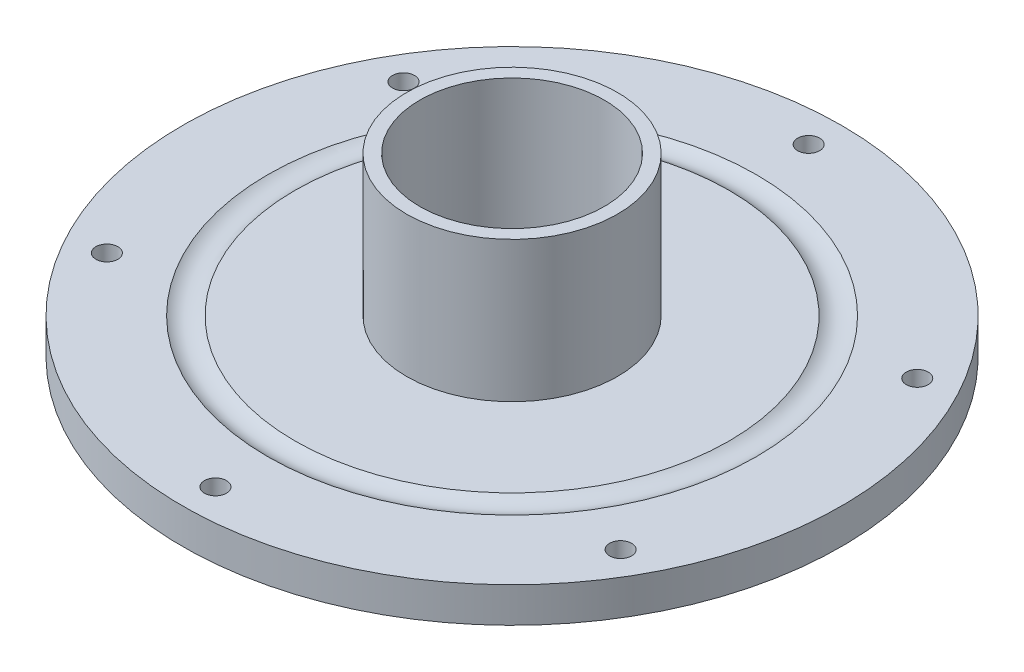
ISO-10303-21;
HEADER;
FILE_DESCRIPTION(('STEP AP214'),'2;1');
FILE_NAME('part.step','',(''),(''),'','','');
FILE_SCHEMA(('AUTOMOTIVE_DESIGN { 1 0 10303 214 1 1 1 1 }'));
ENDSEC;
DATA;
#1=APPLICATION_CONTEXT('core data for automotive mechanical design processes');
#2=APPLICATION_PROTOCOL_DEFINITION('international standard','automotive_design',2000,#1);
#3=PRODUCT_CONTEXT('',#1,'mechanical');
#4=PRODUCT('Part','Part','',(#3));
#5=PRODUCT_RELATED_PRODUCT_CATEGORY('part','',(#4));
#6=PRODUCT_DEFINITION_FORMATION('','',#4);
#7=PRODUCT_DEFINITION_CONTEXT('part definition',#1,'design');
#8=PRODUCT_DEFINITION('design','',#6,#7);
#9=PRODUCT_DEFINITION_SHAPE('','',#8);
#10=(LENGTH_UNIT() NAMED_UNIT(*) SI_UNIT(.MILLI.,.METRE.));
#11=(NAMED_UNIT(*) PLANE_ANGLE_UNIT() SI_UNIT($,.RADIAN.));
#12=(NAMED_UNIT(*) SI_UNIT($,.STERADIAN.) SOLID_ANGLE_UNIT());
#13=UNCERTAINTY_MEASURE_WITH_UNIT(LENGTH_MEASURE(1.E-05),#10,'distance_accuracy_value','');
#14=(GEOMETRIC_REPRESENTATION_CONTEXT(3) GLOBAL_UNCERTAINTY_ASSIGNED_CONTEXT((#13)) GLOBAL_UNIT_ASSIGNED_CONTEXT((#10,
#11,#12)) REPRESENTATION_CONTEXT('',''));
#15=CARTESIAN_POINT('',(0.,0.,0.));
#16=DIRECTION('',(0.,0.,1.));
#17=DIRECTION('',(1.,0.,0.));
#18=AXIS2_PLACEMENT_3D('',#15,#16,#17);
#19=CARTESIAN_POINT('',(47.,6.87240000000009,0.));
#20=DIRECTION('',(0.,1.,0.));
#21=DIRECTION('',(0.,0.,1.));
#22=AXIS2_PLACEMENT_3D('',#19,#20,#21);
#23=PLANE('',#22);
#24=CARTESIAN_POINT('',(0.,6.8724,0.));
#25=DIRECTION('',(0.,-1.,0.));
#26=DIRECTION('',(0.,0.,-1.));
#27=AXIS2_PLACEMENT_3D('',#24,#25,#26);
#28=CIRCLE('',#27,2.5);
#29=CARTESIAN_POINT('',(0.,6.8724,-2.5));
#30=VERTEX_POINT('',#29);
#31=EDGE_CURVE('E93',#30,#30,#28,.T.);
#32=ORIENTED_EDGE('',*,*,#31,.T.);
#33=EDGE_LOOP('',(#32));
#34=FACE_BOUND('',#33,.T.);
#35=CARTESIAN_POINT('',(-17.4999999999995,6.8724,-4.96308349082816E-13));
#36=DIRECTION('',(0.,-1.,0.));
#37=DIRECTION('',(0.,0.,-1.));
#38=AXIS2_PLACEMENT_3D('',#35,#36,#37);
#39=CIRCLE('',#38,1.9);
#40=CARTESIAN_POINT('',(-17.4999999999995,6.8724,-1.9000000000005));
#41=VERTEX_POINT('',#40);
#42=EDGE_CURVE('E89',#41,#41,#39,.T.);
#43=ORIENTED_EDGE('',*,*,#42,.T.);
#44=EDGE_LOOP('',(#43));
#45=FACE_BOUND('',#44,.T.);
#46=CARTESIAN_POINT('',(9.88330434368617E-13,6.8724,-17.5));
#47=DIRECTION('',(0.,-1.,0.));
#48=DIRECTION('',(0.,0.,-1.));
#49=AXIS2_PLACEMENT_3D('',#46,#47,#48);
#50=CIRCLE('',#49,1.9);
#51=CARTESIAN_POINT('',(9.88330434368617E-13,6.8724,-19.4));
#52=VERTEX_POINT('',#51);
#53=EDGE_CURVE('E97',#52,#52,#50,.T.);
#54=ORIENTED_EDGE('',*,*,#53,.T.);
#55=EDGE_LOOP('',(#54));
#56=FACE_BOUND('',#55,.T.);
#57=CARTESIAN_POINT('',(17.5000000000005,6.8724,4.94165217184309E-13));
#58=DIRECTION('',(0.,-1.,0.));
#59=DIRECTION('',(0.,0.,-1.));
#60=AXIS2_PLACEMENT_3D('',#57,#58,#59);
#61=CIRCLE('',#60,1.9);
#62=CARTESIAN_POINT('',(17.5000000000005,6.8724,-1.8999999999995));
#63=VERTEX_POINT('',#62);
#64=EDGE_CURVE('E94',#63,#63,#61,.T.);
#65=ORIENTED_EDGE('',*,*,#64,.T.);
#66=EDGE_LOOP('',(#65));
#67=FACE_BOUND('',#66,.T.);
#68=CARTESIAN_POINT('',(0.,6.8724,17.5));
#69=DIRECTION('',(0.,-1.,0.));
#70=DIRECTION('',(0.,0.,-1.));
#71=AXIS2_PLACEMENT_3D('',#68,#69,#70);
#72=CIRCLE('',#71,1.9);
#73=CARTESIAN_POINT('',(0.,6.8724,15.6));
#74=VERTEX_POINT('',#73);
#75=EDGE_CURVE('E90',#74,#74,#72,.T.);
#76=ORIENTED_EDGE('',*,*,#75,.T.);
#77=EDGE_LOOP('',(#76));
#78=FACE_BOUND('',#77,.T.);
#79=CARTESIAN_POINT('',(0.,6.8724000000001,0.));
#80=DIRECTION('',(0.,1.,0.));
#81=DIRECTION('',(0.,0.,1.));
#82=AXIS2_PLACEMENT_3D('',#79,#80,#81);
#83=CIRCLE('',#82,21.);
#84=CARTESIAN_POINT('',(0.,6.8724000000001,21.));
#85=VERTEX_POINT('',#84);
#86=EDGE_CURVE('E11',#85,#85,#83,.F.);
#87=ORIENTED_EDGE('',*,*,#86,.F.);
#88=EDGE_LOOP('',(#87));
#89=FACE_BOUND('',#88,.T.);
#90=ADVANCED_FACE('F41',(#34,#45,#56,#67,#78,#89),#23,.T.);
#91=CARTESIAN_POINT('',(0.,6.8724,0.));
#92=DIRECTION('',(0.,-1.,0.));
#93=DIRECTION('',(0.,0.,-1.));
#94=AXIS2_PLACEMENT_3D('',#91,#92,#93);
#95=CYLINDRICAL_SURFACE('',#94,2.5);
#96=ORIENTED_EDGE('',*,*,#31,.F.);
#97=EDGE_LOOP('',(#96));
#98=FACE_BOUND('',#97,.T.);
#99=CARTESIAN_POINT('',(0.,1.8724,0.));
#100=DIRECTION('',(0.,-1.,0.));
#101=DIRECTION('',(0.,0.,-1.));
#102=AXIS2_PLACEMENT_3D('',#99,#100,#101);
#103=CIRCLE('',#102,2.5);
#104=CARTESIAN_POINT('',(0.,1.8724,-2.5));
#105=VERTEX_POINT('',#104);
#106=EDGE_CURVE('E86',#105,#105,#103,.F.);
#107=ORIENTED_EDGE('',*,*,#106,.F.);
#108=EDGE_LOOP('',(#107));
#109=FACE_BOUND('',#108,.T.);
#110=ADVANCED_FACE('F127',(#98,#109),#95,.F.);
#111=CARTESIAN_POINT('',(-17.4999999999995,6.8724,-4.96308349082816E-13));
#112=DIRECTION('',(0.,-1.,0.));
#113=DIRECTION('',(0.,0.,-1.));
#114=AXIS2_PLACEMENT_3D('',#111,#112,#113);
#115=CYLINDRICAL_SURFACE('',#114,1.9);
#116=ORIENTED_EDGE('',*,*,#42,.F.);
#117=EDGE_LOOP('',(#116));
#118=FACE_BOUND('',#117,.T.);
#119=CARTESIAN_POINT('',(-17.4999999999995,1.8724,-4.96308349082816E-13));
#120=DIRECTION('',(0.,-1.,0.));
#121=DIRECTION('',(0.,0.,-1.));
#122=AXIS2_PLACEMENT_3D('',#119,#120,#121);
#123=CIRCLE('',#122,1.9);
#124=CARTESIAN_POINT('',(-17.4999999999995,1.8724,-1.9000000000005));
#125=VERTEX_POINT('',#124);
#126=EDGE_CURVE('E83',#125,#125,#123,.F.);
#127=ORIENTED_EDGE('',*,*,#126,.F.);
#128=EDGE_LOOP('',(#127));
#129=FACE_BOUND('',#128,.T.);
#130=ADVANCED_FACE('F133',(#118,#129),#115,.F.);
#131=CARTESIAN_POINT('',(9.88330434368617E-13,6.8724,-17.5));
#132=DIRECTION('',(0.,-1.,0.));
#133=DIRECTION('',(0.,0.,-1.));
#134=AXIS2_PLACEMENT_3D('',#131,#132,#133);
#135=CYLINDRICAL_SURFACE('',#134,1.9);
#136=ORIENTED_EDGE('',*,*,#53,.F.);
#137=EDGE_LOOP('',(#136));
#138=FACE_BOUND('',#137,.T.);
#139=CARTESIAN_POINT('',(9.88330434368617E-13,1.8724,-17.5));
#140=DIRECTION('',(0.,-1.,0.));
#141=DIRECTION('',(0.,0.,-1.));
#142=AXIS2_PLACEMENT_3D('',#139,#140,#141);
#143=CIRCLE('',#142,1.9);
#144=CARTESIAN_POINT('',(9.88330434368617E-13,1.8724,-19.4));
#145=VERTEX_POINT('',#144);
#146=EDGE_CURVE('E67',#145,#145,#143,.F.);
#147=ORIENTED_EDGE('',*,*,#146,.F.);
#148=EDGE_LOOP('',(#147));
#149=FACE_BOUND('',#148,.T.);
#150=ADVANCED_FACE('F262',(#138,#149),#135,.F.);
#151=CARTESIAN_POINT('',(17.5000000000005,6.8724,4.94165217184309E-13));
#152=DIRECTION('',(0.,-1.,0.));
#153=DIRECTION('',(0.,0.,-1.));
#154=AXIS2_PLACEMENT_3D('',#151,#152,#153);
#155=CYLINDRICAL_SURFACE('',#154,1.9);
#156=ORIENTED_EDGE('',*,*,#64,.F.);
#157=EDGE_LOOP('',(#156));
#158=FACE_BOUND('',#157,.T.);
#159=CARTESIAN_POINT('',(17.5000000000005,1.8724,4.94165217184309E-13));
#160=DIRECTION('',(0.,-1.,0.));
#161=DIRECTION('',(0.,0.,-1.));
#162=AXIS2_PLACEMENT_3D('',#159,#160,#161);
#163=CIRCLE('',#162,1.9);
#164=CARTESIAN_POINT('',(17.5000000000005,1.8724,-1.8999999999995));
#165=VERTEX_POINT('',#164);
#166=EDGE_CURVE('E62',#165,#165,#163,.F.);
#167=ORIENTED_EDGE('',*,*,#166,.F.);
#168=EDGE_LOOP('',(#167));
#169=FACE_BOUND('',#168,.T.);
#170=ADVANCED_FACE('F258',(#158,#169),#155,.F.);
#171=CARTESIAN_POINT('',(0.,6.8724,17.5));
#172=DIRECTION('',(0.,-1.,0.));
#173=DIRECTION('',(0.,0.,-1.));
#174=AXIS2_PLACEMENT_3D('',#171,#172,#173);
#175=CYLINDRICAL_SURFACE('',#174,1.9);
#176=ORIENTED_EDGE('',*,*,#75,.F.);
#177=EDGE_LOOP('',(#176));
#178=FACE_BOUND('',#177,.T.);
#179=CARTESIAN_POINT('',(0.,1.8724,17.5));
#180=DIRECTION('',(0.,-1.,0.));
#181=DIRECTION('',(0.,0.,-1.));
#182=AXIS2_PLACEMENT_3D('',#179,#180,#181);
#183=CIRCLE('',#182,1.9);
#184=CARTESIAN_POINT('',(0.,1.8724,15.6));
#185=VERTEX_POINT('',#184);
#186=EDGE_CURVE('E60',#185,#185,#183,.F.);
#187=ORIENTED_EDGE('',*,*,#186,.F.);
#188=EDGE_LOOP('',(#187));
#189=FACE_BOUND('',#188,.T.);
#190=ADVANCED_FACE('F145',(#178,#189),#175,.F.);
#191=CARTESIAN_POINT('',(59.,-1.1276,0.));
#192=DIRECTION('',(0.,-1.,0.));
#193=DIRECTION('',(0.,0.,-1.));
#194=AXIS2_PLACEMENT_3D('',#191,#192,#193);
#195=PLANE('',#194);
#196=CARTESIAN_POINT('',(-42.2194600806596,-1.1276,-16.1979597933077));
#197=DIRECTION('',(0.,-1.,0.));
#198=DIRECTION('',(0.,0.,-1.));
#199=AXIS2_PLACEMENT_3D('',#196,#197,#198);
#200=CIRCLE('',#199,2.);
#201=CARTESIAN_POINT('',(-42.2194600806596,-1.1276,-18.1979597933077));
#202=VERTEX_POINT('',#201);
#203=EDGE_CURVE('E200',#202,#202,#200,.T.);
#204=ORIENTED_EDGE('',*,*,#203,.F.);
#205=EDGE_LOOP('',(#204));
#206=FACE_BOUND('',#205,.T.);
#207=CARTESIAN_POINT('',(-40.9509841413659,-1.1276,20.1763276645553));
#208=DIRECTION('',(0.,-1.,0.));
#209=DIRECTION('',(0.,0.,-1.));
#210=AXIS2_PLACEMENT_3D('',#207,#208,#209);
#211=CIRCLE('',#210,2.);
#212=CARTESIAN_POINT('',(-40.9509841413659,-1.1276,18.1763276645552));
#213=VERTEX_POINT('',#212);
#214=EDGE_CURVE('E206',#213,#213,#211,.T.);
#215=ORIENTED_EDGE('',*,*,#214,.F.);
#216=EDGE_LOOP('',(#215));
#217=FACE_BOUND('',#216,.T.);
#218=CARTESIAN_POINT('',(21.1606113619128,-1.1276,39.7451837331136));
#219=DIRECTION('',(0.,-1.,0.));
#220=DIRECTION('',(0.,0.,-1.));
#221=AXIS2_PLACEMENT_3D('',#218,#219,#220);
#222=CIRCLE('',#221,2.);
#223=CARTESIAN_POINT('',(21.1606113619128,-1.1276,37.7451837331136));
#224=VERTEX_POINT('',#223);
#225=EDGE_CURVE('E212',#224,#224,#222,.T.);
#226=ORIENTED_EDGE('',*,*,#225,.F.);
#227=EDGE_LOOP('',(#226));
#228=FACE_BOUND('',#227,.T.);
#229=CARTESIAN_POINT('',(-15.1004584332728,-1.1276,42.8808872561681));
#230=DIRECTION('',(0.,-1.,0.));
#231=DIRECTION('',(0.,0.,-1.));
#232=AXIS2_PLACEMENT_3D('',#229,#230,#231);
#233=CIRCLE('',#232,2.);
#234=CARTESIAN_POINT('',(-15.1004584332728,-1.1276,40.8808872561681));
#235=VERTEX_POINT('',#234);
#236=EDGE_CURVE('E194',#235,#235,#233,.T.);
#237=ORIENTED_EDGE('',*,*,#236,.F.);
#238=EDGE_LOOP('',(#237));
#239=FACE_BOUND('',#238,.T.);
#240=CARTESIAN_POINT('',(0.,-1.1276,-67.5));
#241=DIRECTION('',(0.,-1.,0.));
#242=DIRECTION('',(0.,0.,-1.));
#243=AXIS2_PLACEMENT_3D('',#240,#241,#242);
#244=CIRCLE('',#243,2.5);
#245=CARTESIAN_POINT('',(0.,-1.1276,-70.));
#246=VERTEX_POINT('',#245);
#247=EDGE_CURVE('E158',#246,#246,#244,.T.);
#248=ORIENTED_EDGE('',*,*,#247,.F.);
#249=EDGE_LOOP('',(#248));
#250=FACE_BOUND('',#249,.T.);
#251=CARTESIAN_POINT('',(58.4567147554496,-1.1276,-33.75));
#252=DIRECTION('',(0.,-1.,0.));
#253=DIRECTION('',(0.,0.,-1.));
#254=AXIS2_PLACEMENT_3D('',#251,#252,#253);
#255=CIRCLE('',#254,2.5);
#256=CARTESIAN_POINT('',(58.4567147554496,-1.1276,-36.25));
#257=VERTEX_POINT('',#256);
#258=EDGE_CURVE('E186',#257,#257,#255,.T.);
#259=ORIENTED_EDGE('',*,*,#258,.F.);
#260=EDGE_LOOP('',(#259));
#261=FACE_BOUND('',#260,.T.);
#262=CARTESIAN_POINT('',(58.4567147554496,-1.1276,33.75));
#263=DIRECTION('',(0.,-1.,0.));
#264=DIRECTION('',(0.,0.,-1.));
#265=AXIS2_PLACEMENT_3D('',#262,#263,#264);
#266=CIRCLE('',#265,2.5);
#267=CARTESIAN_POINT('',(58.4567147554496,-1.1276,31.25));
#268=VERTEX_POINT('',#267);
#269=EDGE_CURVE('E161',#268,#268,#266,.T.);
#270=ORIENTED_EDGE('',*,*,#269,.F.);
#271=EDGE_LOOP('',(#270));
#272=FACE_BOUND('',#271,.T.);
#273=CARTESIAN_POINT('',(0.,-1.1276,67.5));
#274=DIRECTION('',(0.,-1.,0.));
#275=DIRECTION('',(0.,0.,-1.));
#276=AXIS2_PLACEMENT_3D('',#273,#274,#275);
#277=CIRCLE('',#276,2.5);
#278=CARTESIAN_POINT('',(0.,-1.1276,65.));
#279=VERTEX_POINT('',#278);
#280=EDGE_CURVE('E168',#279,#279,#277,.T.);
#281=ORIENTED_EDGE('',*,*,#280,.F.);
#282=EDGE_LOOP('',(#281));
#283=FACE_BOUND('',#282,.T.);
#284=CARTESIAN_POINT('',(-58.4567147554496,-1.1276,33.75));
#285=DIRECTION('',(0.,-1.,0.));
#286=DIRECTION('',(0.,0.,-1.));
#287=AXIS2_PLACEMENT_3D('',#284,#285,#286);
#288=CIRCLE('',#287,2.5);
#289=CARTESIAN_POINT('',(-58.4567147554496,-1.1276,31.25));
#290=VERTEX_POINT('',#289);
#291=EDGE_CURVE('E174',#290,#290,#288,.T.);
#292=ORIENTED_EDGE('',*,*,#291,.F.);
#293=EDGE_LOOP('',(#292));
#294=FACE_BOUND('',#293,.T.);
#295=CARTESIAN_POINT('',(-58.4567147554496,-1.1276,-33.75));
#296=DIRECTION('',(0.,-1.,0.));
#297=DIRECTION('',(0.,0.,-1.));
#298=AXIS2_PLACEMENT_3D('',#295,#296,#297);
#299=CIRCLE('',#298,2.5);
#300=CARTESIAN_POINT('',(-58.4567147554496,-1.1276,-36.25));
#301=VERTEX_POINT('',#300);
#302=EDGE_CURVE('E180',#301,#301,#299,.T.);
#303=ORIENTED_EDGE('',*,*,#302,.F.);
#304=EDGE_LOOP('',(#303));
#305=FACE_BOUND('',#304,.T.);
#306=CARTESIAN_POINT('',(0.,-1.1276,0.));
#307=DIRECTION('',(0.,-1.,0.));
#308=DIRECTION('',(0.,0.,-1.));
#309=AXIS2_PLACEMENT_3D('',#306,#307,#308);
#310=CIRCLE('',#309,22.5);
#311=CARTESIAN_POINT('',(0.,-1.1276,-22.5));
#312=VERTEX_POINT('',#311);
#313=EDGE_CURVE('E70',#312,#312,#310,.T.);
#314=ORIENTED_EDGE('',*,*,#313,.F.);
#315=EDGE_LOOP('',(#314));
#316=FACE_BOUND('',#315,.T.);
#317=CARTESIAN_POINT('',(0.,-1.1276,0.));
#318=DIRECTION('',(0.,-1.,0.));
#319=DIRECTION('',(0.,0.,-1.));
#320=AXIS2_PLACEMENT_3D('',#317,#318,#319);
#321=CIRCLE('',#320,75.);
#322=CARTESIAN_POINT('',(0.,-1.1276,-75.));
#323=VERTEX_POINT('',#322);
#324=EDGE_CURVE('E104',#323,#323,#321,.T.);
#325=ORIENTED_EDGE('',*,*,#324,.T.);
#326=EDGE_LOOP('',(#325));
#327=FACE_BOUND('',#326,.T.);
#328=ADVANCED_FACE('F43',(#206,#217,#228,#239,#250,#261,#272,#283,#294,#305,#316,#327),#195,.T.);
#329=CARTESIAN_POINT('',(0.,6.87240000000009,0.));
#330=DIRECTION('',(0.,1.,0.));
#331=DIRECTION('',(0.,0.,1.));
#332=AXIS2_PLACEMENT_3D('',#329,#330,#331);
#333=CIRCLE('',#332,24.);
#334=CARTESIAN_POINT('',(0.,6.87240000000009,24.));
#335=VERTEX_POINT('',#334);
#336=EDGE_CURVE('E78',#335,#335,#333,.T.);
#337=ORIENTED_EDGE('',*,*,#336,.F.);
#338=EDGE_LOOP('',(#337));
#339=FACE_BOUND('',#338,.T.);
#340=CARTESIAN_POINT('',(0.,6.8724,0.));
#341=DIRECTION('',(0.,1.,0.));
#342=DIRECTION('',(0.,0.,1.));
#343=AXIS2_PLACEMENT_3D('',#340,#341,#342);
#344=CIRCLE('',#343,49.4043);
#345=CARTESIAN_POINT('',(0.,6.8724,49.4043));
#346=VERTEX_POINT('',#345);
#347=EDGE_CURVE('E48',#346,#346,#344,.T.);
#348=ORIENTED_EDGE('',*,*,#347,.T.);
#349=EDGE_LOOP('',(#348));
#350=FACE_BOUND('',#349,.T.);
#351=ADVANCED_FACE('F129',(#339,#350),#23,.T.);
#352=CARTESIAN_POINT('',(0.,11.,0.));
#353=DIRECTION('',(0.,1.,0.));
#354=DIRECTION('',(0.,0.,1.));
#355=AXIS2_PLACEMENT_3D('',#352,#353,#354);
#356=TOROIDAL_SURFACE('',#355,52.5,5.15950000000006);
#357=CARTESIAN_POINT('',(0.,6.87239999999989,0.));
#358=DIRECTION('',(0.,1.,0.));
#359=DIRECTION('',(0.,0.,1.));
#360=AXIS2_PLACEMENT_3D('',#357,#358,#359);
#361=CIRCLE('',#360,55.5957);
#362=CARTESIAN_POINT('',(0.,6.87239999999989,55.5957));
#363=VERTEX_POINT('',#362);
#364=EDGE_CURVE('E52',#363,#363,#361,.T.);
#365=ORIENTED_EDGE('',*,*,#364,.T.);
#366=EDGE_LOOP('',(#365));
#367=FACE_BOUND('',#366,.T.);
#368=ORIENTED_EDGE('',*,*,#347,.F.);
#369=EDGE_LOOP('',(#368));
#370=FACE_BOUND('',#369,.T.);
#371=ADVANCED_FACE('F122',(#367,#370),#356,.F.);
#372=CARTESIAN_POINT('',(55.5957,6.87239999999995,0.));
#373=DIRECTION('',(0.,1.,0.));
#374=DIRECTION('',(0.,0.,1.));
#375=AXIS2_PLACEMENT_3D('',#372,#373,#374);
#376=PLANE('',#375);
#377=CARTESIAN_POINT('',(0.,6.8724,-67.5));
#378=DIRECTION('',(0.,-1.,0.));
#379=DIRECTION('',(0.,0.,-1.));
#380=AXIS2_PLACEMENT_3D('',#377,#378,#379);
#381=CIRCLE('',#380,2.5);
#382=CARTESIAN_POINT('',(0.,6.8724,-70.));
#383=VERTEX_POINT('',#382);
#384=EDGE_CURVE('E153',#383,#383,#381,.T.);
#385=ORIENTED_EDGE('',*,*,#384,.T.);
#386=EDGE_LOOP('',(#385));
#387=FACE_BOUND('',#386,.T.);
#388=CARTESIAN_POINT('',(58.4567147554496,6.8724,-33.75));
#389=DIRECTION('',(0.,-1.,0.));
#390=DIRECTION('',(0.,0.,-1.));
#391=AXIS2_PLACEMENT_3D('',#388,#389,#390);
#392=CIRCLE('',#391,2.5);
#393=CARTESIAN_POINT('',(58.4567147554496,6.8724,-36.25));
#394=VERTEX_POINT('',#393);
#395=EDGE_CURVE('E165',#394,#394,#392,.T.);
#396=ORIENTED_EDGE('',*,*,#395,.T.);
#397=EDGE_LOOP('',(#396));
#398=FACE_BOUND('',#397,.T.);
#399=CARTESIAN_POINT('',(58.4567147554496,6.8724,33.75));
#400=DIRECTION('',(0.,-1.,0.));
#401=DIRECTION('',(0.,0.,-1.));
#402=AXIS2_PLACEMENT_3D('',#399,#400,#401);
#403=CIRCLE('',#402,2.5);
#404=CARTESIAN_POINT('',(58.4567147554496,6.8724,31.25));
#405=VERTEX_POINT('',#404);
#406=EDGE_CURVE('E164',#405,#405,#403,.T.);
#407=ORIENTED_EDGE('',*,*,#406,.T.);
#408=EDGE_LOOP('',(#407));
#409=FACE_BOUND('',#408,.T.);
#410=CARTESIAN_POINT('',(0.,6.8724,67.5));
#411=DIRECTION('',(0.,-1.,0.));
#412=DIRECTION('',(0.,0.,-1.));
#413=AXIS2_PLACEMENT_3D('',#410,#411,#412);
#414=CIRCLE('',#413,2.5);
#415=CARTESIAN_POINT('',(0.,6.8724,65.));
#416=VERTEX_POINT('',#415);
#417=EDGE_CURVE('E171',#416,#416,#414,.T.);
#418=ORIENTED_EDGE('',*,*,#417,.T.);
#419=EDGE_LOOP('',(#418));
#420=FACE_BOUND('',#419,.T.);
#421=CARTESIAN_POINT('',(-58.4567147554496,6.8724,33.75));
#422=DIRECTION('',(0.,-1.,0.));
#423=DIRECTION('',(0.,0.,-1.));
#424=AXIS2_PLACEMENT_3D('',#421,#422,#423);
#425=CIRCLE('',#424,2.5);
#426=CARTESIAN_POINT('',(-58.4567147554496,6.8724,31.25));
#427=VERTEX_POINT('',#426);
#428=EDGE_CURVE('E177',#427,#427,#425,.T.);
#429=ORIENTED_EDGE('',*,*,#428,.T.);
#430=EDGE_LOOP('',(#429));
#431=FACE_BOUND('',#430,.T.);
#432=CARTESIAN_POINT('',(-58.4567147554496,6.8724,-33.75));
#433=DIRECTION('',(0.,-1.,0.));
#434=DIRECTION('',(0.,0.,-1.));
#435=AXIS2_PLACEMENT_3D('',#432,#433,#434);
#436=CIRCLE('',#435,2.5);
#437=CARTESIAN_POINT('',(-58.4567147554496,6.8724,-36.25));
#438=VERTEX_POINT('',#437);
#439=EDGE_CURVE('E183',#438,#438,#436,.T.);
#440=ORIENTED_EDGE('',*,*,#439,.T.);
#441=EDGE_LOOP('',(#440));
#442=FACE_BOUND('',#441,.T.);
#443=ORIENTED_EDGE('',*,*,#364,.F.);
#444=EDGE_LOOP('',(#443));
#445=FACE_BOUND('',#444,.T.);
#446=CARTESIAN_POINT('',(0.,6.8724,0.));
#447=DIRECTION('',(0.,-1.,0.));
#448=DIRECTION('',(0.,0.,-1.));
#449=AXIS2_PLACEMENT_3D('',#446,#447,#448);
#450=CIRCLE('',#449,75.);
#451=CARTESIAN_POINT('',(0.,6.8724,-75.));
#452=VERTEX_POINT('',#451);
#453=EDGE_CURVE('E57',#452,#452,#450,.T.);
#454=ORIENTED_EDGE('',*,*,#453,.F.);
#455=EDGE_LOOP('',(#454));
#456=FACE_BOUND('',#455,.T.);
#457=ADVANCED_FACE('F113',(#387,#398,#409,#420,#431,#442,#445,#456),#376,.T.);
#458=CARTESIAN_POINT('',(0.,6.8724,0.));
#459=DIRECTION('',(0.,-1.,0.));
#460=DIRECTION('',(0.,0.,-1.));
#461=AXIS2_PLACEMENT_3D('',#458,#459,#460);
#462=CYLINDRICAL_SURFACE('',#461,75.);
#463=ORIENTED_EDGE('',*,*,#453,.T.);
#464=EDGE_LOOP('',(#463));
#465=FACE_BOUND('',#464,.T.);
#466=ORIENTED_EDGE('',*,*,#324,.F.);
#467=EDGE_LOOP('',(#466));
#468=FACE_BOUND('',#467,.T.);
#469=ADVANCED_FACE('F110',(#465,#468),#462,.T.);
#470=CARTESIAN_POINT('',(0.,1.8724,0.));
#471=DIRECTION('',(0.,-1.,0.));
#472=DIRECTION('',(0.,0.,-1.));
#473=AXIS2_PLACEMENT_3D('',#470,#471,#472);
#474=PLANE('',#473);
#475=CARTESIAN_POINT('',(0.,1.8724,0.));
#476=DIRECTION('',(0.,-1.,0.));
#477=DIRECTION('',(0.,0.,-1.));
#478=AXIS2_PLACEMENT_3D('',#475,#476,#477);
#479=CIRCLE('',#478,22.5);
#480=CARTESIAN_POINT('',(0.,1.8724,-22.5));
#481=VERTEX_POINT('',#480);
#482=EDGE_CURVE('E63',#481,#481,#479,.T.);
#483=ORIENTED_EDGE('',*,*,#482,.T.);
#484=EDGE_LOOP('',(#483));
#485=FACE_BOUND('',#484,.T.);
#486=ORIENTED_EDGE('',*,*,#186,.T.);
#487=EDGE_LOOP('',(#486));
#488=FACE_BOUND('',#487,.T.);
#489=ORIENTED_EDGE('',*,*,#166,.T.);
#490=EDGE_LOOP('',(#489));
#491=FACE_BOUND('',#490,.T.);
#492=ORIENTED_EDGE('',*,*,#146,.T.);
#493=EDGE_LOOP('',(#492));
#494=FACE_BOUND('',#493,.T.);
#495=ORIENTED_EDGE('',*,*,#126,.T.);
#496=EDGE_LOOP('',(#495));
#497=FACE_BOUND('',#496,.T.);
#498=ORIENTED_EDGE('',*,*,#106,.T.);
#499=EDGE_LOOP('',(#498));
#500=FACE_BOUND('',#499,.T.);
#501=ADVANCED_FACE('F112',(#485,#488,#491,#494,#497,#500),#474,.T.);
#502=CARTESIAN_POINT('',(0.,1.8724,0.));
#503=DIRECTION('',(0.,-1.,0.));
#504=DIRECTION('',(0.,0.,-1.));
#505=AXIS2_PLACEMENT_3D('',#502,#503,#504);
#506=CYLINDRICAL_SURFACE('',#505,22.5);
#507=ORIENTED_EDGE('',*,*,#482,.F.);
#508=EDGE_LOOP('',(#507));
#509=FACE_BOUND('',#508,.T.);
#510=ORIENTED_EDGE('',*,*,#313,.T.);
#511=EDGE_LOOP('',(#510));
#512=FACE_BOUND('',#511,.T.);
#513=ADVANCED_FACE('F120',(#509,#512),#506,.F.);
#514=CARTESIAN_POINT('',(0.,38.8724000000001,0.));
#515=DIRECTION('',(0.,1.,0.));
#516=DIRECTION('',(0.,0.,1.));
#517=AXIS2_PLACEMENT_3D('',#514,#515,#516);
#518=PLANE('',#517);
#519=CARTESIAN_POINT('',(0.,38.8724000000001,0.));
#520=DIRECTION('',(0.,1.,0.));
#521=DIRECTION('',(0.,0.,1.));
#522=AXIS2_PLACEMENT_3D('',#519,#520,#521);
#523=CIRCLE('',#522,24.);
#524=CARTESIAN_POINT('',(0.,38.8724000000001,24.));
#525=VERTEX_POINT('',#524);
#526=EDGE_CURVE('E75',#525,#525,#523,.T.);
#527=ORIENTED_EDGE('',*,*,#526,.T.);
#528=EDGE_LOOP('',(#527));
#529=FACE_BOUND('',#528,.T.);
#530=CARTESIAN_POINT('',(0.,38.8724000000001,0.));
#531=DIRECTION('',(0.,1.,0.));
#532=DIRECTION('',(0.,0.,1.));
#533=AXIS2_PLACEMENT_3D('',#530,#531,#532);
#534=CIRCLE('',#533,21.);
#535=CARTESIAN_POINT('',(0.,38.8724000000001,21.));
#536=VERTEX_POINT('',#535);
#537=EDGE_CURVE('E150',#536,#536,#534,.T.);
#538=ORIENTED_EDGE('',*,*,#537,.F.);
#539=EDGE_LOOP('',(#538));
#540=FACE_BOUND('',#539,.T.);
#541=ADVANCED_FACE('F245',(#529,#540),#518,.T.);
#542=CARTESIAN_POINT('',(0.,38.8724000000001,0.));
#543=DIRECTION('',(0.,-1.,0.));
#544=DIRECTION('',(0.,0.,-1.));
#545=AXIS2_PLACEMENT_3D('',#542,#543,#544);
#546=CYLINDRICAL_SURFACE('',#545,24.);
#547=ORIENTED_EDGE('',*,*,#526,.F.);
#548=EDGE_LOOP('',(#547));
#549=FACE_BOUND('',#548,.T.);
#550=ORIENTED_EDGE('',*,*,#336,.T.);
#551=EDGE_LOOP('',(#550));
#552=FACE_BOUND('',#551,.T.);
#553=ADVANCED_FACE('F251',(#549,#552),#546,.T.);
#554=CARTESIAN_POINT('',(0.,38.8724000000001,0.));
#555=DIRECTION('',(0.,-1.,0.));
#556=DIRECTION('',(0.,0.,-1.));
#557=AXIS2_PLACEMENT_3D('',#554,#555,#556);
#558=CYLINDRICAL_SURFACE('',#557,21.);
#559=ORIENTED_EDGE('',*,*,#537,.T.);
#560=EDGE_LOOP('',(#559));
#561=FACE_BOUND('',#560,.T.);
#562=ORIENTED_EDGE('',*,*,#86,.T.);
#563=EDGE_LOOP('',(#562));
#564=FACE_BOUND('',#563,.T.);
#565=ADVANCED_FACE('F407',(#561,#564),#558,.F.);
#566=CARTESIAN_POINT('',(-58.4567147554496,6.8724,-33.75));
#567=DIRECTION('',(0.,-1.,0.));
#568=DIRECTION('',(0.,0.,-1.));
#569=AXIS2_PLACEMENT_3D('',#566,#567,#568);
#570=CYLINDRICAL_SURFACE('',#569,2.5);
#571=ORIENTED_EDGE('',*,*,#439,.F.);
#572=EDGE_LOOP('',(#571));
#573=FACE_BOUND('',#572,.T.);
#574=ORIENTED_EDGE('',*,*,#302,.T.);
#575=EDGE_LOOP('',(#574));
#576=FACE_BOUND('',#575,.T.);
#577=ADVANCED_FACE('F403',(#573,#576),#570,.F.);
#578=CARTESIAN_POINT('',(-58.4567147554496,6.8724,33.75));
#579=DIRECTION('',(0.,-1.,0.));
#580=DIRECTION('',(0.,0.,-1.));
#581=AXIS2_PLACEMENT_3D('',#578,#579,#580);
#582=CYLINDRICAL_SURFACE('',#581,2.5);
#583=ORIENTED_EDGE('',*,*,#428,.F.);
#584=EDGE_LOOP('',(#583));
#585=FACE_BOUND('',#584,.T.);
#586=ORIENTED_EDGE('',*,*,#291,.T.);
#587=EDGE_LOOP('',(#586));
#588=FACE_BOUND('',#587,.T.);
#589=ADVANCED_FACE('F406',(#585,#588),#582,.F.);
#590=CARTESIAN_POINT('',(0.,6.8724,67.5));
#591=DIRECTION('',(0.,-1.,0.));
#592=DIRECTION('',(0.,0.,-1.));
#593=AXIS2_PLACEMENT_3D('',#590,#591,#592);
#594=CYLINDRICAL_SURFACE('',#593,2.5);
#595=ORIENTED_EDGE('',*,*,#417,.F.);
#596=EDGE_LOOP('',(#595));
#597=FACE_BOUND('',#596,.T.);
#598=ORIENTED_EDGE('',*,*,#280,.T.);
#599=EDGE_LOOP('',(#598));
#600=FACE_BOUND('',#599,.T.);
#601=ADVANCED_FACE('F411',(#597,#600),#594,.F.);
#602=CARTESIAN_POINT('',(58.4567147554496,6.8724,33.75));
#603=DIRECTION('',(0.,-1.,0.));
#604=DIRECTION('',(0.,0.,-1.));
#605=AXIS2_PLACEMENT_3D('',#602,#603,#604);
#606=CYLINDRICAL_SURFACE('',#605,2.5);
#607=ORIENTED_EDGE('',*,*,#406,.F.);
#608=EDGE_LOOP('',(#607));
#609=FACE_BOUND('',#608,.T.);
#610=ORIENTED_EDGE('',*,*,#269,.T.);
#611=EDGE_LOOP('',(#610));
#612=FACE_BOUND('',#611,.T.);
#613=ADVANCED_FACE('F401',(#609,#612),#606,.F.);
#614=CARTESIAN_POINT('',(58.4567147554496,6.8724,-33.75));
#615=DIRECTION('',(0.,-1.,0.));
#616=DIRECTION('',(0.,0.,-1.));
#617=AXIS2_PLACEMENT_3D('',#614,#615,#616);
#618=CYLINDRICAL_SURFACE('',#617,2.5);
#619=ORIENTED_EDGE('',*,*,#395,.F.);
#620=EDGE_LOOP('',(#619));
#621=FACE_BOUND('',#620,.T.);
#622=ORIENTED_EDGE('',*,*,#258,.T.);
#623=EDGE_LOOP('',(#622));
#624=FACE_BOUND('',#623,.T.);
#625=ADVANCED_FACE('F397',(#621,#624),#618,.F.);
#626=CARTESIAN_POINT('',(0.,6.8724,-67.5));
#627=DIRECTION('',(0.,-1.,0.));
#628=DIRECTION('',(0.,0.,-1.));
#629=AXIS2_PLACEMENT_3D('',#626,#627,#628);
#630=CYLINDRICAL_SURFACE('',#629,2.5);
#631=ORIENTED_EDGE('',*,*,#384,.F.);
#632=EDGE_LOOP('',(#631));
#633=FACE_BOUND('',#632,.T.);
#634=ORIENTED_EDGE('',*,*,#247,.T.);
#635=EDGE_LOOP('',(#634));
#636=FACE_BOUND('',#635,.T.);
#637=ADVANCED_FACE('F318',(#633,#636),#630,.F.);
#638=CARTESIAN_POINT('',(-15.1004584332728,0.872400000000001,42.8808872561681));
#639=DIRECTION('',(0.,-1.,0.));
#640=DIRECTION('',(0.,0.,-1.));
#641=AXIS2_PLACEMENT_3D('',#638,#639,#640);
#642=CYLINDRICAL_SURFACE('',#641,2.);
#643=CARTESIAN_POINT('',(-15.1004584332728,0.872400000000001,42.8808872561681));
#644=DIRECTION('',(0.,-1.,0.));
#645=DIRECTION('',(0.,0.,-1.));
#646=AXIS2_PLACEMENT_3D('',#643,#644,#645);
#647=CIRCLE('',#646,2.);
#648=CARTESIAN_POINT('',(-15.1004584332728,0.872400000000001,40.8808872561681));
#649=VERTEX_POINT('',#648);
#650=EDGE_CURVE('E189',#649,#649,#647,.T.);
#651=ORIENTED_EDGE('',*,*,#650,.F.);
#652=EDGE_LOOP('',(#651));
#653=FACE_BOUND('',#652,.T.);
#654=ORIENTED_EDGE('',*,*,#236,.T.);
#655=EDGE_LOOP('',(#654));
#656=FACE_BOUND('',#655,.T.);
#657=ADVANCED_FACE('F323',(#653,#656),#642,.F.);
#658=CARTESIAN_POINT('',(-15.1004584332728,0.872400000000001,42.8808872561681));
#659=DIRECTION('',(0.,-1.,0.));
#660=DIRECTION('',(0.,0.,-1.));
#661=AXIS2_PLACEMENT_3D('',#658,#659,#660);
#662=PLANE('',#661);
#663=ORIENTED_EDGE('',*,*,#650,.T.);
#664=EDGE_LOOP('',(#663));
#665=FACE_BOUND('',#664,.T.);
#666=ADVANCED_FACE('F223',(#665),#662,.T.);
#667=CARTESIAN_POINT('',(21.1606113619128,0.872400000000001,39.7451837331136));
#668=DIRECTION('',(0.,-1.,0.));
#669=DIRECTION('',(0.,0.,-1.));
#670=AXIS2_PLACEMENT_3D('',#667,#668,#669);
#671=CYLINDRICAL_SURFACE('',#670,2.);
#672=CARTESIAN_POINT('',(21.1606113619128,0.872400000000001,39.7451837331136));
#673=DIRECTION('',(0.,-1.,0.));
#674=DIRECTION('',(0.,0.,-1.));
#675=AXIS2_PLACEMENT_3D('',#672,#673,#674);
#676=CIRCLE('',#675,2.);
#677=CARTESIAN_POINT('',(21.1606113619128,0.872400000000001,37.7451837331136));
#678=VERTEX_POINT('',#677);
#679=EDGE_CURVE('E197',#678,#678,#676,.T.);
#680=ORIENTED_EDGE('',*,*,#679,.F.);
#681=EDGE_LOOP('',(#680));
#682=FACE_BOUND('',#681,.T.);
#683=ORIENTED_EDGE('',*,*,#225,.T.);
#684=EDGE_LOOP('',(#683));
#685=FACE_BOUND('',#684,.T.);
#686=ADVANCED_FACE('F220',(#682,#685),#671,.F.);
#687=CARTESIAN_POINT('',(21.1606113619128,0.872400000000001,39.7451837331136));
#688=DIRECTION('',(0.,-1.,0.));
#689=DIRECTION('',(0.,0.,-1.));
#690=AXIS2_PLACEMENT_3D('',#687,#688,#689);
#691=PLANE('',#690);
#692=ORIENTED_EDGE('',*,*,#679,.T.);
#693=EDGE_LOOP('',(#692));
#694=FACE_BOUND('',#693,.T.);
#695=ADVANCED_FACE('F218',(#694),#691,.T.);
#696=CARTESIAN_POINT('',(-40.9509841413659,0.872400000000001,20.1763276645553));
#697=DIRECTION('',(0.,-1.,0.));
#698=DIRECTION('',(0.,0.,-1.));
#699=AXIS2_PLACEMENT_3D('',#696,#697,#698);
#700=CYLINDRICAL_SURFACE('',#699,2.);
#701=CARTESIAN_POINT('',(-40.9509841413659,0.872400000000001,20.1763276645553));
#702=DIRECTION('',(0.,-1.,0.));
#703=DIRECTION('',(0.,0.,-1.));
#704=AXIS2_PLACEMENT_3D('',#701,#702,#703);
#705=CIRCLE('',#704,2.);
#706=CARTESIAN_POINT('',(-40.9509841413659,0.872400000000001,18.1763276645552));
#707=VERTEX_POINT('',#706);
#708=EDGE_CURVE('E209',#707,#707,#705,.T.);
#709=ORIENTED_EDGE('',*,*,#708,.F.);
#710=EDGE_LOOP('',(#709));
#711=FACE_BOUND('',#710,.T.);
#712=ORIENTED_EDGE('',*,*,#214,.T.);
#713=EDGE_LOOP('',(#712));
#714=FACE_BOUND('',#713,.T.);
#715=ADVANCED_FACE('F352',(#711,#714),#700,.F.);
#716=CARTESIAN_POINT('',(-40.9509841413659,0.872400000000001,20.1763276645553));
#717=DIRECTION('',(0.,-1.,0.));
#718=DIRECTION('',(0.,0.,-1.));
#719=AXIS2_PLACEMENT_3D('',#716,#717,#718);
#720=PLANE('',#719);
#721=ORIENTED_EDGE('',*,*,#708,.T.);
#722=EDGE_LOOP('',(#721));
#723=FACE_BOUND('',#722,.T.);
#724=ADVANCED_FACE('F361',(#723),#720,.T.);
#725=CARTESIAN_POINT('',(-42.2194600806596,0.872400000000001,-16.1979597933077));
#726=DIRECTION('',(0.,-1.,0.));
#727=DIRECTION('',(0.,0.,-1.));
#728=AXIS2_PLACEMENT_3D('',#725,#726,#727);
#729=CYLINDRICAL_SURFACE('',#728,2.);
#730=CARTESIAN_POINT('',(-42.2194600806596,0.872400000000001,-16.1979597933077));
#731=DIRECTION('',(0.,-1.,0.));
#732=DIRECTION('',(0.,0.,-1.));
#733=AXIS2_PLACEMENT_3D('',#730,#731,#732);
#734=CIRCLE('',#733,2.);
#735=CARTESIAN_POINT('',(-42.2194600806596,0.872400000000001,-18.1979597933077));
#736=VERTEX_POINT('',#735);
#737=EDGE_CURVE('E203',#736,#736,#734,.T.);
#738=ORIENTED_EDGE('',*,*,#737,.F.);
#739=EDGE_LOOP('',(#738));
#740=FACE_BOUND('',#739,.T.);
#741=ORIENTED_EDGE('',*,*,#203,.T.);
#742=EDGE_LOOP('',(#741));
#743=FACE_BOUND('',#742,.T.);
#744=ADVANCED_FACE('F371',(#740,#743),#729,.F.);
#745=CARTESIAN_POINT('',(-42.2194600806596,0.872400000000001,-16.1979597933077));
#746=DIRECTION('',(0.,-1.,0.));
#747=DIRECTION('',(0.,0.,-1.));
#748=AXIS2_PLACEMENT_3D('',#745,#746,#747);
#749=PLANE('',#748);
#750=ORIENTED_EDGE('',*,*,#737,.T.);
#751=EDGE_LOOP('',(#750));
#752=FACE_BOUND('',#751,.T.);
#753=ADVANCED_FACE('F381',(#752),#749,.T.);
#754=CLOSED_SHELL('',(#90,#110,#130,#150,#170,#190,#328,#351,#371,#457,#469,#501,#513,#541,#553,
#565,#577,#589,#601,#613,#625,#637,#657,#666,#686,#695,#715,#724,#744,#753));
#755=MANIFOLD_SOLID_BREP('B2',#754);
#756=ADVANCED_BREP_SHAPE_REPRESENTATION('',(#18,#755),#14);
#757=SHAPE_DEFINITION_REPRESENTATION(#9,#756);
ENDSEC;
END-ISO-10303-21;
